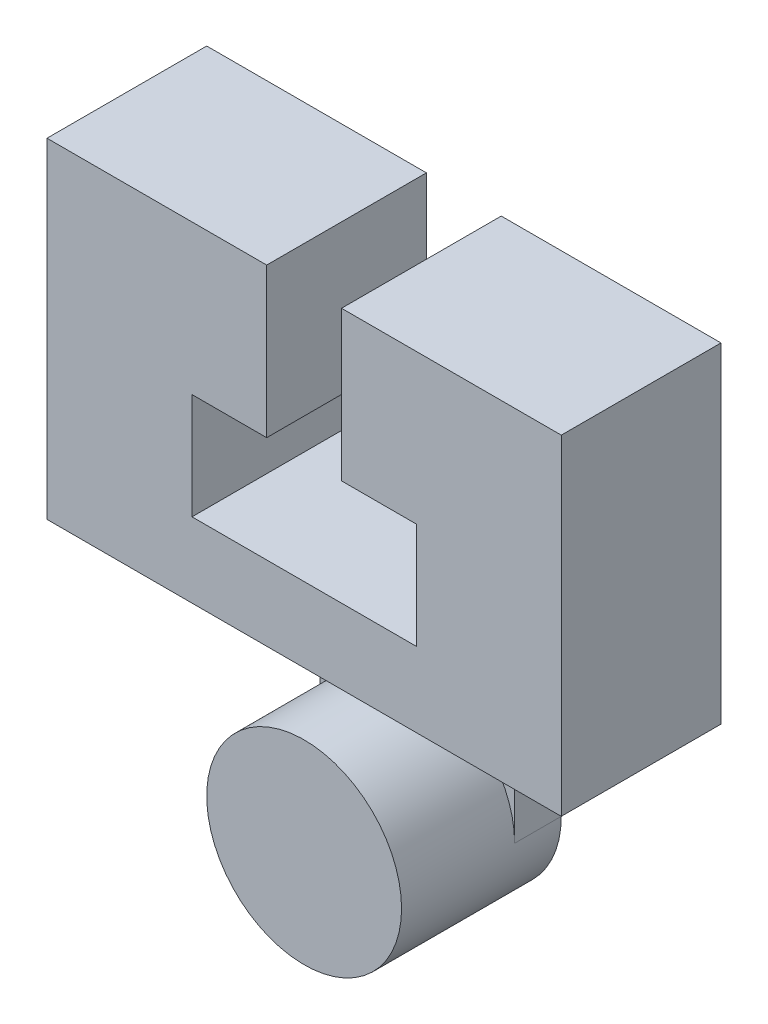
ISO-10303-21;
HEADER;
FILE_DESCRIPTION(('STEP AP214'),'2;1');
FILE_NAME('part.step','',(''),(''),'','','');
FILE_SCHEMA(('AUTOMOTIVE_DESIGN { 1 0 10303 214 1 1 1 1 }'));
ENDSEC;
DATA;
#1=APPLICATION_CONTEXT('core data for automotive mechanical design processes');
#2=APPLICATION_PROTOCOL_DEFINITION('international standard','automotive_design',2000,#1);
#3=PRODUCT_CONTEXT('',#1,'mechanical');
#4=PRODUCT('Part','Part','',(#3));
#5=PRODUCT_RELATED_PRODUCT_CATEGORY('part','',(#4));
#6=PRODUCT_DEFINITION_FORMATION('','',#4);
#7=PRODUCT_DEFINITION_CONTEXT('part definition',#1,'design');
#8=PRODUCT_DEFINITION('design','',#6,#7);
#9=PRODUCT_DEFINITION_SHAPE('','',#8);
#10=(LENGTH_UNIT() NAMED_UNIT(*) SI_UNIT(.MILLI.,.METRE.));
#11=(NAMED_UNIT(*) PLANE_ANGLE_UNIT() SI_UNIT($,.RADIAN.));
#12=(NAMED_UNIT(*) SI_UNIT($,.STERADIAN.) SOLID_ANGLE_UNIT());
#13=UNCERTAINTY_MEASURE_WITH_UNIT(LENGTH_MEASURE(1.E-05),#10,'distance_accuracy_value','');
#14=(GEOMETRIC_REPRESENTATION_CONTEXT(3) GLOBAL_UNCERTAINTY_ASSIGNED_CONTEXT((#13)) GLOBAL_UNIT_ASSIGNED_CONTEXT((#10,
#11,#12)) REPRESENTATION_CONTEXT('',''));
#15=CARTESIAN_POINT('',(0.,0.,0.));
#16=DIRECTION('',(0.,0.,1.));
#17=DIRECTION('',(1.,0.,0.));
#18=AXIS2_PLACEMENT_3D('',#15,#16,#17);
#19=CARTESIAN_POINT('',(40.894,77.9018,97.189073188502));
#20=DIRECTION('',(0.,1.,0.));
#21=DIRECTION('',(0.,0.,1.));
#22=AXIS2_PLACEMENT_3D('',#19,#20,#21);
#23=PLANE('',#22);
#24=DIRECTION('',(0.,0.,-1.));
#25=VECTOR('',#24,1.);
#26=CARTESIAN_POINT('',(-5.9554872,77.9018,0.));
#27=LINE('',#26,#25);
#28=CARTESIAN_POINT('',(-5.9554872,77.9018,0.));
#29=VERTEX_POINT('',#28);
#30=CARTESIAN_POINT('',(-5.9554872,77.9018,-25.4));
#31=VERTEX_POINT('',#30);
#32=EDGE_CURVE('E213',#29,#31,#27,.T.);
#33=ORIENTED_EDGE('',*,*,#32,.T.);
#34=DIRECTION('',(1.,0.,0.));
#35=VECTOR('',#34,1.);
#36=CARTESIAN_POINT('',(40.894,77.9018,-25.4));
#37=LINE('',#36,#35);
#38=CARTESIAN_POINT('',(-40.894,77.9018,-25.4));
#39=VERTEX_POINT('',#38);
#40=EDGE_CURVE('E235',#39,#31,#37,.T.);
#41=ORIENTED_EDGE('',*,*,#40,.F.);
#42=DIRECTION('',(0.,0.,-1.));
#43=VECTOR('',#42,1.);
#44=CARTESIAN_POINT('',(-40.894,77.9018,97.189073188502));
#45=LINE('',#44,#43);
#46=CARTESIAN_POINT('',(-40.894,77.9018,0.));
#47=VERTEX_POINT('',#46);
#48=EDGE_CURVE('E243',#47,#39,#45,.T.);
#49=ORIENTED_EDGE('',*,*,#48,.F.);
#50=DIRECTION('',(1.,0.,0.));
#51=VECTOR('',#50,1.);
#52=CARTESIAN_POINT('',(40.894,77.9018,0.));
#53=LINE('',#52,#51);
#54=EDGE_CURVE('E253',#47,#29,#53,.T.);
#55=ORIENTED_EDGE('',*,*,#54,.T.);
#56=EDGE_LOOP('',(#33,#41,#49,#55));
#57=FACE_BOUND('',#56,.T.);
#58=ADVANCED_FACE('F47',(#57),#23,.T.);
#59=CARTESIAN_POINT('',(0.,0.,-25.4));
#60=DIRECTION('',(0.,0.,1.));
#61=DIRECTION('',(1.,0.,0.));
#62=AXIS2_PLACEMENT_3D('',#59,#60,#61);
#63=CYLINDRICAL_SURFACE('',#62,15.494);
#64=DIRECTION('',(0.,0.,-1.));
#65=VECTOR('',#64,1.);
#66=CARTESIAN_POINT('',(15.494,0.,-17.9832));
#67=LINE('',#66,#65);
#68=CARTESIAN_POINT('',(15.494,0.,-17.9832));
#69=VERTEX_POINT('',#68);
#70=CARTESIAN_POINT('',(15.494,0.,-25.4));
#71=VERTEX_POINT('',#70);
#72=EDGE_CURVE('E279',#69,#71,#67,.T.);
#73=ORIENTED_EDGE('',*,*,#72,.F.);
#74=CARTESIAN_POINT('',(0.,0.,-17.9832));
#75=DIRECTION('',(0.,0.,1.));
#76=DIRECTION('',(-1.,0.,0.));
#77=AXIS2_PLACEMENT_3D('',#74,#75,#76);
#78=CIRCLE('',#77,15.494);
#79=CARTESIAN_POINT('',(-15.494,0.,-17.9832));
#80=VERTEX_POINT('',#79);
#81=EDGE_CURVE('E70',#69,#80,#78,.T.);
#82=ORIENTED_EDGE('',*,*,#81,.T.);
#83=DIRECTION('',(0.,0.,-1.));
#84=VECTOR('',#83,1.);
#85=CARTESIAN_POINT('',(-15.494,0.,-17.9832));
#86=LINE('',#85,#84);
#87=CARTESIAN_POINT('',(-15.494,0.,-25.4));
#88=VERTEX_POINT('',#87);
#89=EDGE_CURVE('E274',#80,#88,#86,.T.);
#90=ORIENTED_EDGE('',*,*,#89,.T.);
#91=CARTESIAN_POINT('',(0.,0.,-25.4));
#92=DIRECTION('',(0.,0.,1.));
#93=DIRECTION('',(1.,0.,0.));
#94=AXIS2_PLACEMENT_3D('',#91,#92,#93);
#95=CIRCLE('',#94,15.494);
#96=EDGE_CURVE('E11',#88,#71,#95,.T.);
#97=ORIENTED_EDGE('',*,*,#96,.T.);
#98=EDGE_LOOP('',(#73,#82,#90,#97));
#99=FACE_BOUND('',#98,.T.);
#100=CARTESIAN_POINT('',(0.,0.,0.));
#101=DIRECTION('',(0.,0.,1.));
#102=DIRECTION('',(1.,0.,0.));
#103=AXIS2_PLACEMENT_3D('',#100,#101,#102);
#104=CIRCLE('',#103,15.494);
#105=CARTESIAN_POINT('',(15.494,0.,0.));
#106=VERTEX_POINT('',#105);
#107=EDGE_CURVE('E51',#106,#106,#104,.T.);
#108=ORIENTED_EDGE('',*,*,#107,.F.);
#109=EDGE_LOOP('',(#108));
#110=FACE_BOUND('',#109,.T.);
#111=ADVANCED_FACE('F49',(#99,#110),#63,.T.);
#112=CARTESIAN_POINT('',(0.,0.,-25.4));
#113=DIRECTION('',(0.,0.,1.));
#114=DIRECTION('',(1.,0.,0.));
#115=AXIS2_PLACEMENT_3D('',#112,#113,#114);
#116=PLANE('',#115);
#117=ORIENTED_EDGE('',*,*,#40,.T.);
#118=DIRECTION('',(0.,1.,0.));
#119=VECTOR('',#118,1.);
#120=CARTESIAN_POINT('',(-5.9554872,54.1274,-25.4));
#121=LINE('',#120,#119);
#122=CARTESIAN_POINT('',(-5.9554872,54.1274,-25.4));
#123=VERTEX_POINT('',#122);
#124=EDGE_CURVE('E182',#123,#31,#121,.T.);
#125=ORIENTED_EDGE('',*,*,#124,.F.);
#126=DIRECTION('',(1.,0.,0.));
#127=VECTOR('',#126,1.);
#128=CARTESIAN_POINT('',(-17.8308,54.1274,-25.4));
#129=LINE('',#128,#127);
#130=CARTESIAN_POINT('',(-17.8308,54.1274,-25.4));
#131=VERTEX_POINT('',#130);
#132=EDGE_CURVE('E184',#131,#123,#129,.T.);
#133=ORIENTED_EDGE('',*,*,#132,.F.);
#134=DIRECTION('',(0.,1.,0.));
#135=VECTOR('',#134,1.);
#136=CARTESIAN_POINT('',(-17.8308,37.2872,-25.4));
#137=LINE('',#136,#135);
#138=CARTESIAN_POINT('',(-17.8308,37.2872,-25.4));
#139=VERTEX_POINT('',#138);
#140=EDGE_CURVE('E208',#139,#131,#137,.T.);
#141=ORIENTED_EDGE('',*,*,#140,.F.);
#142=DIRECTION('',(-1.,0.,0.));
#143=VECTOR('',#142,1.);
#144=CARTESIAN_POINT('',(17.8308,37.2872,-25.4));
#145=LINE('',#144,#143);
#146=CARTESIAN_POINT('',(17.8308,37.2872,-25.4));
#147=VERTEX_POINT('',#146);
#148=EDGE_CURVE('E205',#147,#139,#145,.T.);
#149=ORIENTED_EDGE('',*,*,#148,.F.);
#150=DIRECTION('',(0.,-1.,0.));
#151=VECTOR('',#150,1.);
#152=CARTESIAN_POINT('',(17.8308,54.1274,-25.4));
#153=LINE('',#152,#151);
#154=CARTESIAN_POINT('',(17.8308,54.1274,-25.4));
#155=VERTEX_POINT('',#154);
#156=EDGE_CURVE('E202',#155,#147,#153,.T.);
#157=ORIENTED_EDGE('',*,*,#156,.F.);
#158=DIRECTION('',(1.,0.,0.));
#159=VECTOR('',#158,1.);
#160=CARTESIAN_POINT('',(5.94478872,54.1274,-25.4));
#161=LINE('',#160,#159);
#162=CARTESIAN_POINT('',(5.94478872,54.1274,-25.4));
#163=VERTEX_POINT('',#162);
#164=EDGE_CURVE('E200',#163,#155,#161,.T.);
#165=ORIENTED_EDGE('',*,*,#164,.F.);
#166=DIRECTION('',(0.,-1.,0.));
#167=VECTOR('',#166,1.);
#168=CARTESIAN_POINT('',(5.94478872,77.9018,-25.4));
#169=LINE('',#168,#167);
#170=CARTESIAN_POINT('',(5.94478872,77.9018,-25.4));
#171=VERTEX_POINT('',#170);
#172=EDGE_CURVE('E162',#171,#163,#169,.T.);
#173=ORIENTED_EDGE('',*,*,#172,.F.);
#174=CARTESIAN_POINT('',(40.894,77.9018,-25.4));
#175=VERTEX_POINT('',#174);
#176=EDGE_CURVE('E238',#171,#175,#37,.T.);
#177=ORIENTED_EDGE('',*,*,#176,.T.);
#178=DIRECTION('',(0.,-1.,0.));
#179=VECTOR('',#178,1.);
#180=CARTESIAN_POINT('',(40.894,25.4,-25.4));
#181=LINE('',#180,#179);
#182=CARTESIAN_POINT('',(40.894,25.4,-25.4));
#183=VERTEX_POINT('',#182);
#184=EDGE_CURVE('E231',#175,#183,#181,.T.);
#185=ORIENTED_EDGE('',*,*,#184,.T.);
#186=DIRECTION('',(-1.,0.,0.));
#187=VECTOR('',#186,1.);
#188=CARTESIAN_POINT('',(15.494,25.4,-25.4));
#189=LINE('',#188,#187);
#190=CARTESIAN_POINT('',(15.494,25.4,-25.4));
#191=VERTEX_POINT('',#190);
#192=EDGE_CURVE('E227',#183,#191,#189,.T.);
#193=ORIENTED_EDGE('',*,*,#192,.T.);
#194=DIRECTION('',(0.,-1.,0.));
#195=VECTOR('',#194,1.);
#196=CARTESIAN_POINT('',(15.494,0.,-25.4));
#197=LINE('',#196,#195);
#198=EDGE_CURVE('E265',#191,#71,#197,.T.);
#199=ORIENTED_EDGE('',*,*,#198,.T.);
#200=ORIENTED_EDGE('',*,*,#96,.F.);
#201=DIRECTION('',(0.,1.,0.));
#202=VECTOR('',#201,1.);
#203=CARTESIAN_POINT('',(-15.494,25.4,-25.4));
#204=LINE('',#203,#202);
#205=CARTESIAN_POINT('',(-15.494,25.4,-25.4));
#206=VERTEX_POINT('',#205);
#207=EDGE_CURVE('E262',#88,#206,#204,.T.);
#208=ORIENTED_EDGE('',*,*,#207,.T.);
#209=CARTESIAN_POINT('',(-40.894,25.4,-25.4));
#210=VERTEX_POINT('',#209);
#211=EDGE_CURVE('E216',#206,#210,#189,.T.);
#212=ORIENTED_EDGE('',*,*,#211,.T.);
#213=DIRECTION('',(0.,1.,0.));
#214=VECTOR('',#213,1.);
#215=CARTESIAN_POINT('',(-40.894,77.9018,-25.4));
#216=LINE('',#215,#214);
#217=EDGE_CURVE('E230',#210,#39,#216,.T.);
#218=ORIENTED_EDGE('',*,*,#217,.T.);
#219=EDGE_LOOP('',(#117,#125,#133,#141,#149,#157,#165,#173,#177,#185,#193,#199,#200,#208,#212,#218));
#220=FACE_BOUND('',#219,.T.);
#221=ADVANCED_FACE('F295',(#220),#116,.F.);
#222=CARTESIAN_POINT('',(0.,0.,0.));
#223=DIRECTION('',(0.,0.,1.));
#224=DIRECTION('',(1.,0.,0.));
#225=AXIS2_PLACEMENT_3D('',#222,#223,#224);
#226=PLANE('',#225);
#227=ORIENTED_EDGE('',*,*,#107,.T.);
#228=EDGE_LOOP('',(#227));
#229=FACE_BOUND('',#228,.T.);
#230=ADVANCED_FACE('F373',(#229),#226,.T.);
#231=CARTESIAN_POINT('',(15.494,0.,-17.9832));
#232=DIRECTION('',(1.,0.,0.));
#233=DIRECTION('',(0.,0.,-1.));
#234=AXIS2_PLACEMENT_3D('',#231,#232,#233);
#235=PLANE('',#234);
#236=ORIENTED_EDGE('',*,*,#198,.F.);
#237=DIRECTION('',(0.,0.,-1.));
#238=VECTOR('',#237,1.);
#239=CARTESIAN_POINT('',(15.494,25.4,-17.9832));
#240=LINE('',#239,#238);
#241=CARTESIAN_POINT('',(15.494,25.4,-17.9832));
#242=VERTEX_POINT('',#241);
#243=EDGE_CURVE('E282',#242,#191,#240,.T.);
#244=ORIENTED_EDGE('',*,*,#243,.F.);
#245=DIRECTION('',(0.,-1.,0.));
#246=VECTOR('',#245,1.);
#247=CARTESIAN_POINT('',(15.494,0.,-17.9832));
#248=LINE('',#247,#246);
#249=EDGE_CURVE('E271',#242,#69,#248,.T.);
#250=ORIENTED_EDGE('',*,*,#249,.T.);
#251=ORIENTED_EDGE('',*,*,#72,.T.);
#252=EDGE_LOOP('',(#236,#244,#250,#251));
#253=FACE_BOUND('',#252,.T.);
#254=ADVANCED_FACE('F335',(#253),#235,.T.);
#255=CARTESIAN_POINT('',(-15.494,25.4,-17.9832));
#256=DIRECTION('',(-1.,0.,0.));
#257=DIRECTION('',(0.,0.,1.));
#258=AXIS2_PLACEMENT_3D('',#255,#256,#257);
#259=PLANE('',#258);
#260=ORIENTED_EDGE('',*,*,#207,.F.);
#261=ORIENTED_EDGE('',*,*,#89,.F.);
#262=DIRECTION('',(0.,1.,0.));
#263=VECTOR('',#262,1.);
#264=CARTESIAN_POINT('',(-15.494,25.4,-17.9832));
#265=LINE('',#264,#263);
#266=CARTESIAN_POINT('',(-15.494,25.4,-17.9832));
#267=VERTEX_POINT('',#266);
#268=EDGE_CURVE('E264',#80,#267,#265,.T.);
#269=ORIENTED_EDGE('',*,*,#268,.T.);
#270=DIRECTION('',(0.,0.,-1.));
#271=VECTOR('',#270,1.);
#272=CARTESIAN_POINT('',(-15.494,25.4,-17.9832));
#273=LINE('',#272,#271);
#274=EDGE_CURVE('E285',#267,#206,#273,.T.);
#275=ORIENTED_EDGE('',*,*,#274,.T.);
#276=EDGE_LOOP('',(#260,#261,#269,#275));
#277=FACE_BOUND('',#276,.T.);
#278=ADVANCED_FACE('F291',(#277),#259,.T.);
#279=CARTESIAN_POINT('',(0.,0.,-17.9832));
#280=DIRECTION('',(0.,0.,-1.));
#281=DIRECTION('',(-1.,0.,0.));
#282=AXIS2_PLACEMENT_3D('',#279,#280,#281);
#283=PLANE('',#282);
#284=ORIENTED_EDGE('',*,*,#81,.F.);
#285=ORIENTED_EDGE('',*,*,#249,.F.);
#286=DIRECTION('',(1.,0.,0.));
#287=VECTOR('',#286,1.);
#288=CARTESIAN_POINT('',(15.494,25.4,-17.9832));
#289=LINE('',#288,#287);
#290=EDGE_CURVE('E268',#267,#242,#289,.T.);
#291=ORIENTED_EDGE('',*,*,#290,.F.);
#292=ORIENTED_EDGE('',*,*,#268,.F.);
#293=EDGE_LOOP('',(#284,#285,#291,#292));
#294=FACE_BOUND('',#293,.T.);
#295=ADVANCED_FACE('F337',(#294),#283,.F.);
#296=CARTESIAN_POINT('',(15.494,25.4,97.189073188502));
#297=DIRECTION('',(0.,-1.,0.));
#298=DIRECTION('',(0.,0.,-1.));
#299=AXIS2_PLACEMENT_3D('',#296,#297,#298);
#300=PLANE('',#299);
#301=ORIENTED_EDGE('',*,*,#274,.F.);
#302=ORIENTED_EDGE('',*,*,#290,.T.);
#303=ORIENTED_EDGE('',*,*,#243,.T.);
#304=ORIENTED_EDGE('',*,*,#192,.F.);
#305=DIRECTION('',(0.,0.,-1.));
#306=VECTOR('',#305,1.);
#307=CARTESIAN_POINT('',(40.894,25.4,97.189073188502));
#308=LINE('',#307,#306);
#309=CARTESIAN_POINT('',(40.894,25.4,0.));
#310=VERTEX_POINT('',#309);
#311=EDGE_CURVE('E248',#310,#183,#308,.T.);
#312=ORIENTED_EDGE('',*,*,#311,.F.);
#313=DIRECTION('',(-1.,0.,0.));
#314=VECTOR('',#313,1.);
#315=CARTESIAN_POINT('',(15.494,25.4,0.));
#316=LINE('',#315,#314);
#317=CARTESIAN_POINT('',(-40.894,25.4,0.));
#318=VERTEX_POINT('',#317);
#319=EDGE_CURVE('E244',#310,#318,#316,.T.);
#320=ORIENTED_EDGE('',*,*,#319,.T.);
#321=DIRECTION('',(0.,0.,-1.));
#322=VECTOR('',#321,1.);
#323=CARTESIAN_POINT('',(-40.894,25.4,97.189073188502));
#324=LINE('',#323,#322);
#325=EDGE_CURVE('E247',#318,#210,#324,.T.);
#326=ORIENTED_EDGE('',*,*,#325,.T.);
#327=ORIENTED_EDGE('',*,*,#211,.F.);
#328=EDGE_LOOP('',(#301,#302,#303,#304,#312,#320,#326,#327));
#329=FACE_BOUND('',#328,.T.);
#330=ADVANCED_FACE('F297',(#329),#300,.T.);
#331=CARTESIAN_POINT('',(0.,0.,0.));
#332=DIRECTION('',(0.,0.,1.));
#333=DIRECTION('',(1.,0.,0.));
#334=AXIS2_PLACEMENT_3D('',#331,#332,#333);
#335=PLANE('',#334);
#336=DIRECTION('',(0.,1.,0.));
#337=VECTOR('',#336,1.);
#338=CARTESIAN_POINT('',(-5.9554872,54.1274,0.));
#339=LINE('',#338,#337);
#340=CARTESIAN_POINT('',(-5.9554872,54.1274,0.));
#341=VERTEX_POINT('',#340);
#342=EDGE_CURVE('E197',#341,#29,#339,.T.);
#343=ORIENTED_EDGE('',*,*,#342,.T.);
#344=ORIENTED_EDGE('',*,*,#54,.F.);
#345=DIRECTION('',(0.,1.,0.));
#346=VECTOR('',#345,1.);
#347=CARTESIAN_POINT('',(-40.894,77.9018,0.));
#348=LINE('',#347,#346);
#349=EDGE_CURVE('E234',#318,#47,#348,.T.);
#350=ORIENTED_EDGE('',*,*,#349,.F.);
#351=ORIENTED_EDGE('',*,*,#319,.F.);
#352=DIRECTION('',(0.,-1.,0.));
#353=VECTOR('',#352,1.);
#354=CARTESIAN_POINT('',(40.894,25.4,0.));
#355=LINE('',#354,#353);
#356=CARTESIAN_POINT('',(40.894,77.9018,0.));
#357=VERTEX_POINT('',#356);
#358=EDGE_CURVE('E249',#357,#310,#355,.T.);
#359=ORIENTED_EDGE('',*,*,#358,.F.);
#360=CARTESIAN_POINT('',(5.94478872,77.9018,0.));
#361=VERTEX_POINT('',#360);
#362=EDGE_CURVE('E181',#361,#357,#53,.T.);
#363=ORIENTED_EDGE('',*,*,#362,.F.);
#364=DIRECTION('',(0.,-1.,0.));
#365=VECTOR('',#364,1.);
#366=CARTESIAN_POINT('',(5.94478872,77.9018,0.));
#367=LINE('',#366,#365);
#368=CARTESIAN_POINT('',(5.94478872,54.1274,0.));
#369=VERTEX_POINT('',#368);
#370=EDGE_CURVE('E62',#361,#369,#367,.T.);
#371=ORIENTED_EDGE('',*,*,#370,.T.);
#372=DIRECTION('',(1.,0.,0.));
#373=VECTOR('',#372,1.);
#374=CARTESIAN_POINT('',(5.94478872,54.1274,0.));
#375=LINE('',#374,#373);
#376=CARTESIAN_POINT('',(17.8308,54.1274,0.));
#377=VERTEX_POINT('',#376);
#378=EDGE_CURVE('E170',#369,#377,#375,.T.);
#379=ORIENTED_EDGE('',*,*,#378,.T.);
#380=DIRECTION('',(0.,-1.,0.));
#381=VECTOR('',#380,1.);
#382=CARTESIAN_POINT('',(17.8308,54.1274,0.));
#383=LINE('',#382,#381);
#384=CARTESIAN_POINT('',(17.8308,37.2872,0.));
#385=VERTEX_POINT('',#384);
#386=EDGE_CURVE('E175',#377,#385,#383,.T.);
#387=ORIENTED_EDGE('',*,*,#386,.T.);
#388=DIRECTION('',(-1.,0.,0.));
#389=VECTOR('',#388,1.);
#390=CARTESIAN_POINT('',(17.8308,37.2872,0.));
#391=LINE('',#390,#389);
#392=CARTESIAN_POINT('',(-17.8308,37.2872,0.));
#393=VERTEX_POINT('',#392);
#394=EDGE_CURVE('E188',#385,#393,#391,.T.);
#395=ORIENTED_EDGE('',*,*,#394,.T.);
#396=DIRECTION('',(0.,1.,0.));
#397=VECTOR('',#396,1.);
#398=CARTESIAN_POINT('',(-17.8308,37.2872,0.));
#399=LINE('',#398,#397);
#400=CARTESIAN_POINT('',(-17.8308,54.1274,0.));
#401=VERTEX_POINT('',#400);
#402=EDGE_CURVE('E191',#393,#401,#399,.T.);
#403=ORIENTED_EDGE('',*,*,#402,.T.);
#404=DIRECTION('',(1.,0.,0.));
#405=VECTOR('',#404,1.);
#406=CARTESIAN_POINT('',(-17.8308,54.1274,0.));
#407=LINE('',#406,#405);
#408=EDGE_CURVE('E194',#401,#341,#407,.T.);
#409=ORIENTED_EDGE('',*,*,#408,.T.);
#410=EDGE_LOOP('',(#343,#344,#350,#351,#359,#363,#371,#379,#387,#395,#403,#409));
#411=FACE_BOUND('',#410,.T.);
#412=ADVANCED_FACE('F179',(#411),#335,.T.);
#413=CARTESIAN_POINT('',(-40.894,77.9018,97.189073188502));
#414=DIRECTION('',(-1.,0.,0.));
#415=DIRECTION('',(0.,0.,1.));
#416=AXIS2_PLACEMENT_3D('',#413,#414,#415);
#417=PLANE('',#416);
#418=ORIENTED_EDGE('',*,*,#325,.F.);
#419=ORIENTED_EDGE('',*,*,#349,.T.);
#420=ORIENTED_EDGE('',*,*,#48,.T.);
#421=ORIENTED_EDGE('',*,*,#217,.F.);
#422=EDGE_LOOP('',(#418,#419,#420,#421));
#423=FACE_BOUND('',#422,.T.);
#424=ADVANCED_FACE('F302',(#423),#417,.T.);
#425=DIRECTION('',(0.,0.,-1.));
#426=VECTOR('',#425,1.);
#427=CARTESIAN_POINT('',(5.94478872,77.9018,0.));
#428=LINE('',#427,#426);
#429=EDGE_CURVE('E167',#361,#171,#428,.T.);
#430=ORIENTED_EDGE('',*,*,#429,.F.);
#431=ORIENTED_EDGE('',*,*,#362,.T.);
#432=DIRECTION('',(0.,0.,-1.));
#433=VECTOR('',#432,1.);
#434=CARTESIAN_POINT('',(40.894,77.9018,97.189073188502));
#435=LINE('',#434,#433);
#436=EDGE_CURVE('E252',#357,#175,#435,.T.);
#437=ORIENTED_EDGE('',*,*,#436,.T.);
#438=ORIENTED_EDGE('',*,*,#176,.F.);
#439=EDGE_LOOP('',(#430,#431,#437,#438));
#440=FACE_BOUND('',#439,.T.);
#441=ADVANCED_FACE('F327',(#440),#23,.T.);
#442=CARTESIAN_POINT('',(40.894,25.4,97.189073188502));
#443=DIRECTION('',(1.,0.,0.));
#444=DIRECTION('',(0.,0.,-1.));
#445=AXIS2_PLACEMENT_3D('',#442,#443,#444);
#446=PLANE('',#445);
#447=ORIENTED_EDGE('',*,*,#436,.F.);
#448=ORIENTED_EDGE('',*,*,#358,.T.);
#449=ORIENTED_EDGE('',*,*,#311,.T.);
#450=ORIENTED_EDGE('',*,*,#184,.F.);
#451=EDGE_LOOP('',(#447,#448,#449,#450));
#452=FACE_BOUND('',#451,.T.);
#453=ADVANCED_FACE('F331',(#452),#446,.T.);
#454=CARTESIAN_POINT('',(-5.9554872,54.1274,0.));
#455=DIRECTION('',(-1.,0.,0.));
#456=DIRECTION('',(0.,-1.,0.));
#457=AXIS2_PLACEMENT_3D('',#454,#455,#456);
#458=PLANE('',#457);
#459=ORIENTED_EDGE('',*,*,#124,.T.);
#460=ORIENTED_EDGE('',*,*,#32,.F.);
#461=ORIENTED_EDGE('',*,*,#342,.F.);
#462=DIRECTION('',(0.,0.,-1.));
#463=VECTOR('',#462,1.);
#464=CARTESIAN_POINT('',(-5.9554872,54.1274,0.));
#465=LINE('',#464,#463);
#466=EDGE_CURVE('E217',#341,#123,#465,.T.);
#467=ORIENTED_EDGE('',*,*,#466,.T.);
#468=EDGE_LOOP('',(#459,#460,#461,#467));
#469=FACE_BOUND('',#468,.T.);
#470=ADVANCED_FACE('F310',(#469),#458,.F.);
#471=CARTESIAN_POINT('',(-17.8308,54.1274,0.));
#472=DIRECTION('',(0.,1.,0.));
#473=DIRECTION('',(0.,0.,1.));
#474=AXIS2_PLACEMENT_3D('',#471,#472,#473);
#475=PLANE('',#474);
#476=ORIENTED_EDGE('',*,*,#132,.T.);
#477=ORIENTED_EDGE('',*,*,#466,.F.);
#478=ORIENTED_EDGE('',*,*,#408,.F.);
#479=DIRECTION('',(0.,0.,-1.));
#480=VECTOR('',#479,1.);
#481=CARTESIAN_POINT('',(-17.8308,54.1274,0.));
#482=LINE('',#481,#480);
#483=EDGE_CURVE('E219',#401,#131,#482,.T.);
#484=ORIENTED_EDGE('',*,*,#483,.T.);
#485=EDGE_LOOP('',(#476,#477,#478,#484));
#486=FACE_BOUND('',#485,.T.);
#487=ADVANCED_FACE('F314',(#486),#475,.F.);
#488=CARTESIAN_POINT('',(-17.8308,37.2872,0.));
#489=DIRECTION('',(-1.,0.,0.));
#490=DIRECTION('',(0.,-1.,0.));
#491=AXIS2_PLACEMENT_3D('',#488,#489,#490);
#492=PLANE('',#491);
#493=ORIENTED_EDGE('',*,*,#140,.T.);
#494=ORIENTED_EDGE('',*,*,#483,.F.);
#495=ORIENTED_EDGE('',*,*,#402,.F.);
#496=DIRECTION('',(0.,0.,-1.));
#497=VECTOR('',#496,1.);
#498=CARTESIAN_POINT('',(-17.8308,37.2872,0.));
#499=LINE('',#498,#497);
#500=EDGE_CURVE('E221',#393,#139,#499,.T.);
#501=ORIENTED_EDGE('',*,*,#500,.T.);
#502=EDGE_LOOP('',(#493,#494,#495,#501));
#503=FACE_BOUND('',#502,.T.);
#504=ADVANCED_FACE('F319',(#503),#492,.F.);
#505=CARTESIAN_POINT('',(17.8308,37.2872,0.));
#506=DIRECTION('',(0.,-1.,0.));
#507=DIRECTION('',(0.,0.,-1.));
#508=AXIS2_PLACEMENT_3D('',#505,#506,#507);
#509=PLANE('',#508);
#510=ORIENTED_EDGE('',*,*,#148,.T.);
#511=ORIENTED_EDGE('',*,*,#500,.F.);
#512=ORIENTED_EDGE('',*,*,#394,.F.);
#513=DIRECTION('',(0.,0.,-1.));
#514=VECTOR('',#513,1.);
#515=CARTESIAN_POINT('',(17.8308,37.2872,0.));
#516=LINE('',#515,#514);
#517=EDGE_CURVE('E223',#385,#147,#516,.T.);
#518=ORIENTED_EDGE('',*,*,#517,.T.);
#519=EDGE_LOOP('',(#510,#511,#512,#518));
#520=FACE_BOUND('',#519,.T.);
#521=ADVANCED_FACE('F322',(#520),#509,.F.);
#522=CARTESIAN_POINT('',(17.8308,54.1274,0.));
#523=DIRECTION('',(1.,0.,0.));
#524=DIRECTION('',(0.,1.,0.));
#525=AXIS2_PLACEMENT_3D('',#522,#523,#524);
#526=PLANE('',#525);
#527=ORIENTED_EDGE('',*,*,#156,.T.);
#528=ORIENTED_EDGE('',*,*,#517,.F.);
#529=ORIENTED_EDGE('',*,*,#386,.F.);
#530=DIRECTION('',(0.,0.,-1.));
#531=VECTOR('',#530,1.);
#532=CARTESIAN_POINT('',(17.8308,54.1274,0.));
#533=LINE('',#532,#531);
#534=EDGE_CURVE('E166',#377,#155,#533,.T.);
#535=ORIENTED_EDGE('',*,*,#534,.T.);
#536=EDGE_LOOP('',(#527,#528,#529,#535));
#537=FACE_BOUND('',#536,.T.);
#538=ADVANCED_FACE('F324',(#537),#526,.F.);
#539=CARTESIAN_POINT('',(5.94478872,54.1274,0.));
#540=DIRECTION('',(0.,1.,0.));
#541=DIRECTION('',(0.,0.,1.));
#542=AXIS2_PLACEMENT_3D('',#539,#540,#541);
#543=PLANE('',#542);
#544=ORIENTED_EDGE('',*,*,#164,.T.);
#545=ORIENTED_EDGE('',*,*,#534,.F.);
#546=ORIENTED_EDGE('',*,*,#378,.F.);
#547=DIRECTION('',(0.,0.,-1.));
#548=VECTOR('',#547,1.);
#549=CARTESIAN_POINT('',(5.94478872,54.1274,0.));
#550=LINE('',#549,#548);
#551=EDGE_CURVE('E158',#369,#163,#550,.T.);
#552=ORIENTED_EDGE('',*,*,#551,.T.);
#553=EDGE_LOOP('',(#544,#545,#546,#552));
#554=FACE_BOUND('',#553,.T.);
#555=ADVANCED_FACE('F171',(#554),#543,.F.);
#556=CARTESIAN_POINT('',(5.94478872,77.9018,0.));
#557=DIRECTION('',(1.,0.,0.));
#558=DIRECTION('',(0.,1.,0.));
#559=AXIS2_PLACEMENT_3D('',#556,#557,#558);
#560=PLANE('',#559);
#561=ORIENTED_EDGE('',*,*,#172,.T.);
#562=ORIENTED_EDGE('',*,*,#551,.F.);
#563=ORIENTED_EDGE('',*,*,#370,.F.);
#564=ORIENTED_EDGE('',*,*,#429,.T.);
#565=EDGE_LOOP('',(#561,#562,#563,#564));
#566=FACE_BOUND('',#565,.T.);
#567=ADVANCED_FACE('F160',(#566),#560,.F.);
#568=CLOSED_SHELL('',(#58,#111,#221,#230,#254,#278,#295,#330,#412,#424,#441,#453,#470,#487,#504,
#521,#538,#555,#567));
#569=MANIFOLD_SOLID_BREP('B2',#568);
#570=ADVANCED_BREP_SHAPE_REPRESENTATION('',(#18,#569),#14);
#571=SHAPE_DEFINITION_REPRESENTATION(#9,#570);
ENDSEC;
END-ISO-10303-21;
